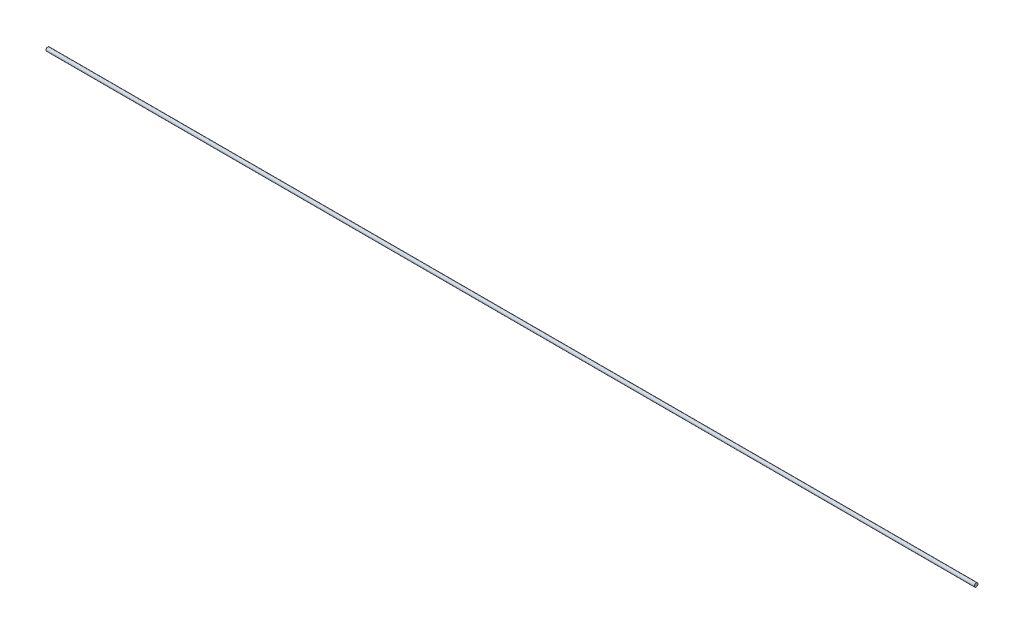
ISO-10303-21;
HEADER;
FILE_DESCRIPTION(('STEP AP214'),'2;1');
FILE_NAME('part.step','',(''),(''),'','','');
FILE_SCHEMA(('AUTOMOTIVE_DESIGN { 1 0 10303 214 1 1 1 1 }'));
ENDSEC;
DATA;
#1=APPLICATION_CONTEXT('core data for automotive mechanical design processes');
#2=APPLICATION_PROTOCOL_DEFINITION('international standard','automotive_design',2000,#1);
#3=PRODUCT_CONTEXT('',#1,'mechanical');
#4=PRODUCT('Part','Part','',(#3));
#5=PRODUCT_RELATED_PRODUCT_CATEGORY('part','',(#4));
#6=PRODUCT_DEFINITION_FORMATION('','',#4);
#7=PRODUCT_DEFINITION_CONTEXT('part definition',#1,'design');
#8=PRODUCT_DEFINITION('design','',#6,#7);
#9=PRODUCT_DEFINITION_SHAPE('','',#8);
#10=(LENGTH_UNIT() NAMED_UNIT(*) SI_UNIT(.MILLI.,.METRE.));
#11=(NAMED_UNIT(*) PLANE_ANGLE_UNIT() SI_UNIT($,.RADIAN.));
#12=(NAMED_UNIT(*) SI_UNIT($,.STERADIAN.) SOLID_ANGLE_UNIT());
#13=UNCERTAINTY_MEASURE_WITH_UNIT(LENGTH_MEASURE(1.E-05),#10,'distance_accuracy_value','');
#14=(GEOMETRIC_REPRESENTATION_CONTEXT(3) GLOBAL_UNCERTAINTY_ASSIGNED_CONTEXT((#13)) GLOBAL_UNIT_ASSIGNED_CONTEXT((#10,
#11,#12)) REPRESENTATION_CONTEXT('',''));
#15=CARTESIAN_POINT('',(0.,0.,0.));
#16=DIRECTION('',(0.,0.,1.));
#17=DIRECTION('',(1.,0.,0.));
#18=AXIS2_PLACEMENT_3D('',#15,#16,#17);
#19=CARTESIAN_POINT('',(300.400000000005,0.,0.));
#20=DIRECTION('',(-1.,0.,0.));
#21=DIRECTION('',(0.,0.,1.));
#22=AXIS2_PLACEMENT_3D('',#19,#20,#21);
#23=CYLINDRICAL_SURFACE('',#22,0.79375);
#24=CARTESIAN_POINT('',(-300.241250000005,0.,0.));
#25=DIRECTION('',(1.,0.,0.));
#26=DIRECTION('',(0.,0.,-1.));
#27=AXIS2_PLACEMENT_3D('',#24,#25,#26);
#28=CIRCLE('',#27,0.79375);
#29=CARTESIAN_POINT('',(-300.241250000005,0.,-0.79375));
#30=VERTEX_POINT('',#29);
#31=EDGE_CURVE('E53',#30,#30,#28,.T.);
#32=ORIENTED_EDGE('',*,*,#31,.T.);
#33=EDGE_LOOP('',(#32));
#34=FACE_BOUND('',#33,.T.);
#35=CARTESIAN_POINT('',(102.280000000005,0.,0.));
#36=DIRECTION('',(1.,0.,0.));
#37=DIRECTION('',(0.,0.,-1.));
#38=AXIS2_PLACEMENT_3D('',#35,#36,#37);
#39=CIRCLE('',#38,0.79375);
#40=CARTESIAN_POINT('',(102.280000000005,0.,-0.79375));
#41=VERTEX_POINT('',#40);
#42=EDGE_CURVE('E49',#41,#41,#39,.T.);
#43=ORIENTED_EDGE('',*,*,#42,.F.);
#44=EDGE_LOOP('',(#43));
#45=FACE_BOUND('',#44,.T.);
#46=ADVANCED_FACE('F45',(#34,#45),#23,.T.);
#47=CARTESIAN_POINT('',(-300.400000000005,0.,0.));
#48=DIRECTION('',(1.,0.,0.));
#49=DIRECTION('',(0.,0.,-1.));
#50=AXIS2_PLACEMENT_3D('',#47,#48,#49);
#51=PLANE('',#50);
#52=CARTESIAN_POINT('',(-300.400000000005,0.,0.));
#53=DIRECTION('',(1.,0.,0.));
#54=DIRECTION('',(0.,0.,-1.));
#55=AXIS2_PLACEMENT_3D('',#52,#53,#54);
#56=CIRCLE('',#55,0.635000000000108);
#57=CARTESIAN_POINT('',(-300.400000000005,0.,-0.635000000000108));
#58=VERTEX_POINT('',#57);
#59=EDGE_CURVE('E10',#58,#58,#56,.F.);
#60=ORIENTED_EDGE('',*,*,#59,.T.);
#61=EDGE_LOOP('',(#60));
#62=FACE_BOUND('',#61,.T.);
#63=ADVANCED_FACE('F66',(#62),#51,.F.);
#64=CARTESIAN_POINT('',(-300.241250000005,0.,0.));
#65=DIRECTION('',(1.,0.,0.));
#66=DIRECTION('',(0.,0.,-1.));
#67=AXIS2_PLACEMENT_3D('',#64,#65,#66);
#68=CONICAL_SURFACE('',#67,0.79375,0.785398163397505);
#69=ORIENTED_EDGE('',*,*,#59,.F.);
#70=EDGE_LOOP('',(#69));
#71=FACE_BOUND('',#70,.T.);
#72=ORIENTED_EDGE('',*,*,#31,.F.);
#73=EDGE_LOOP('',(#72));
#74=FACE_BOUND('',#73,.T.);
#75=ADVANCED_FACE('F47',(#71,#74),#68,.T.);
#76=CARTESIAN_POINT('',(102.280000000005,0.,0.));
#77=DIRECTION('',(1.,0.,0.));
#78=DIRECTION('',(0.,0.,-1.));
#79=AXIS2_PLACEMENT_3D('',#76,#77,#78);
#80=PLANE('',#79);
#81=ORIENTED_EDGE('',*,*,#42,.T.);
#82=EDGE_LOOP('',(#81));
#83=FACE_BOUND('',#82,.T.);
#84=ADVANCED_FACE('F63',(#83),#80,.T.);
#85=CLOSED_SHELL('',(#46,#63,#75,#84));
#86=MANIFOLD_SOLID_BREP('B2',#85);
#87=ADVANCED_BREP_SHAPE_REPRESENTATION('',(#18,#86),#14);
#88=SHAPE_DEFINITION_REPRESENTATION(#9,#87);
ENDSEC;
END-ISO-10303-21;
